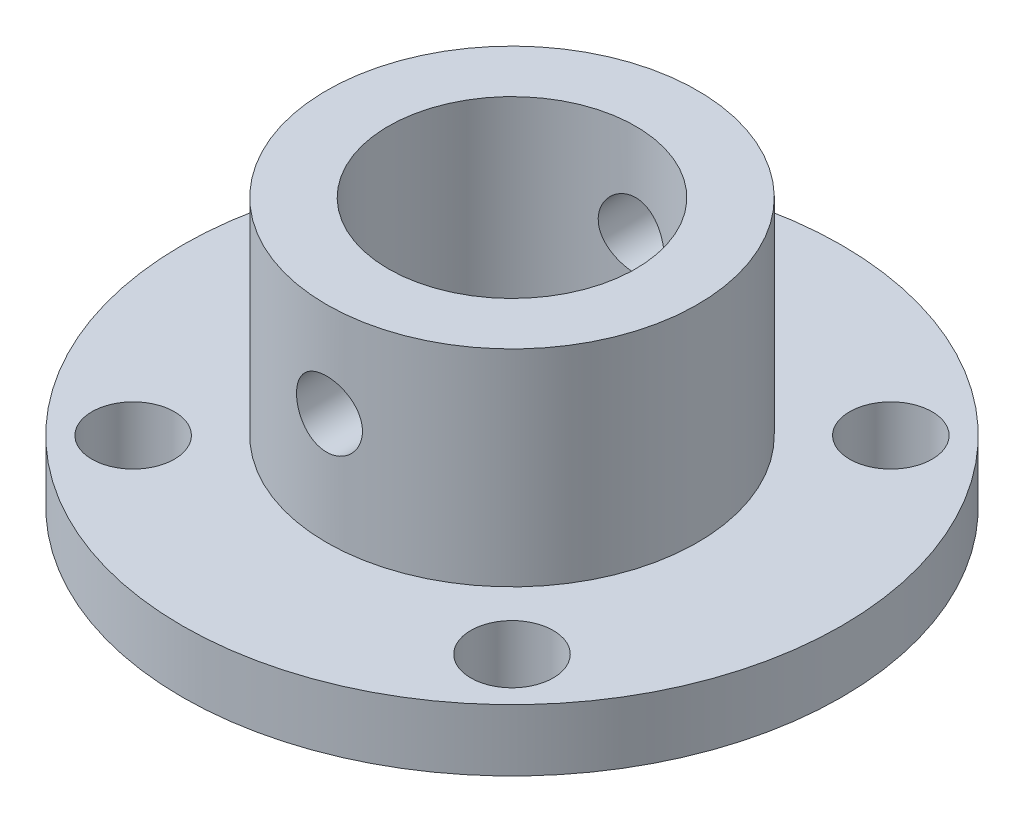
ISO-10303-21;
HEADER;
FILE_DESCRIPTION(('STEP AP214'),'2;1');
FILE_NAME('part.step','',(''),(''),'','','');
FILE_SCHEMA(('AUTOMOTIVE_DESIGN { 1 0 10303 214 1 1 1 1 }'));
ENDSEC;
DATA;
#1=APPLICATION_CONTEXT('core data for automotive mechanical design processes');
#2=APPLICATION_PROTOCOL_DEFINITION('international standard','automotive_design',2000,#1);
#3=PRODUCT_CONTEXT('',#1,'mechanical');
#4=PRODUCT('Part','Part','',(#3));
#5=PRODUCT_RELATED_PRODUCT_CATEGORY('part','',(#4));
#6=PRODUCT_DEFINITION_FORMATION('','',#4);
#7=PRODUCT_DEFINITION_CONTEXT('part definition',#1,'design');
#8=PRODUCT_DEFINITION('design','',#6,#7);
#9=PRODUCT_DEFINITION_SHAPE('','',#8);
#10=(LENGTH_UNIT() NAMED_UNIT(*) SI_UNIT(.MILLI.,.METRE.));
#11=(NAMED_UNIT(*) PLANE_ANGLE_UNIT() SI_UNIT($,.RADIAN.));
#12=(NAMED_UNIT(*) SI_UNIT($,.STERADIAN.) SOLID_ANGLE_UNIT());
#13=UNCERTAINTY_MEASURE_WITH_UNIT(LENGTH_MEASURE(1.E-05),#10,'distance_accuracy_value','');
#14=(GEOMETRIC_REPRESENTATION_CONTEXT(3) GLOBAL_UNCERTAINTY_ASSIGNED_CONTEXT((#13)) GLOBAL_UNIT_ASSIGNED_CONTEXT((#10,
#11,#12)) REPRESENTATION_CONTEXT('',''));
#15=CARTESIAN_POINT('',(0.,0.,0.));
#16=DIRECTION('',(0.,0.,1.));
#17=DIRECTION('',(1.,0.,0.));
#18=AXIS2_PLACEMENT_3D('',#15,#16,#17);
#19=CARTESIAN_POINT('',(0.,3.,0.));
#20=DIRECTION('',(0.,-1.,0.));
#21=DIRECTION('',(0.,0.,-1.));
#22=AXIS2_PLACEMENT_3D('',#19,#20,#21);
#23=CYLINDRICAL_SURFACE('',#22,16.);
#24=CARTESIAN_POINT('',(0.,3.,0.));
#25=DIRECTION('',(0.,1.,0.));
#26=DIRECTION('',(0.,0.,1.));
#27=AXIS2_PLACEMENT_3D('',#24,#25,#26);
#28=CIRCLE('',#27,16.);
#29=CARTESIAN_POINT('',(0.,3.,16.));
#30=VERTEX_POINT('',#29);
#31=EDGE_CURVE('E53',#30,#30,#28,.T.);
#32=ORIENTED_EDGE('',*,*,#31,.F.);
#33=EDGE_LOOP('',(#32));
#34=FACE_BOUND('',#33,.T.);
#35=CARTESIAN_POINT('',(0.,0.,0.));
#36=DIRECTION('',(0.,1.,0.));
#37=DIRECTION('',(0.,0.,1.));
#38=AXIS2_PLACEMENT_3D('',#35,#36,#37);
#39=CIRCLE('',#38,16.);
#40=CARTESIAN_POINT('',(0.,0.,16.));
#41=VERTEX_POINT('',#40);
#42=EDGE_CURVE('E58',#41,#41,#39,.T.);
#43=ORIENTED_EDGE('',*,*,#42,.T.);
#44=EDGE_LOOP('',(#43));
#45=FACE_BOUND('',#44,.T.);
#46=ADVANCED_FACE('F41',(#34,#45),#23,.T.);
#47=CARTESIAN_POINT('',(0.,3.,0.));
#48=DIRECTION('',(0.,1.,0.));
#49=DIRECTION('',(0.,0.,1.));
#50=AXIS2_PLACEMENT_3D('',#47,#48,#49);
#51=PLANE('',#50);
#52=CARTESIAN_POINT('',(0.,3.,0.));
#53=DIRECTION('',(0.,1.,0.));
#54=DIRECTION('',(0.,0.,1.));
#55=AXIS2_PLACEMENT_3D('',#52,#53,#54);
#56=CIRCLE('',#55,9.);
#57=CARTESIAN_POINT('',(0.,3.,9.));
#58=VERTEX_POINT('',#57);
#59=EDGE_CURVE('E10',#58,#58,#56,.T.);
#60=ORIENTED_EDGE('',*,*,#59,.F.);
#61=EDGE_LOOP('',(#60));
#62=FACE_BOUND('',#61,.T.);
#63=CARTESIAN_POINT('',(9.19238815542541,3.,9.19238815542483));
#64=DIRECTION('',(0.,1.,0.));
#65=DIRECTION('',(0.,0.,1.));
#66=AXIS2_PLACEMENT_3D('',#63,#64,#65);
#67=CIRCLE('',#66,2.00000000000041);
#68=CARTESIAN_POINT('',(9.19238815542541,3.,11.1923881554252));
#69=VERTEX_POINT('',#68);
#70=EDGE_CURVE('E81',#69,#69,#67,.T.);
#71=ORIENTED_EDGE('',*,*,#70,.F.);
#72=EDGE_LOOP('',(#71));
#73=FACE_BOUND('',#72,.T.);
#74=CARTESIAN_POINT('',(-9.19238815542514,3.,-9.1923881554251));
#75=DIRECTION('',(0.,1.,0.));
#76=DIRECTION('',(0.,0.,1.));
#77=AXIS2_PLACEMENT_3D('',#74,#75,#76);
#78=CIRCLE('',#77,2.);
#79=CARTESIAN_POINT('',(-9.19238815542514,3.,-7.1923881554251));
#80=VERTEX_POINT('',#79);
#81=EDGE_CURVE('E67',#80,#80,#78,.T.);
#82=ORIENTED_EDGE('',*,*,#81,.F.);
#83=EDGE_LOOP('',(#82));
#84=FACE_BOUND('',#83,.T.);
#85=CARTESIAN_POINT('',(9.19238815542513,3.,-9.19238815542511));
#86=DIRECTION('',(0.,1.,0.));
#87=DIRECTION('',(0.,0.,1.));
#88=AXIS2_PLACEMENT_3D('',#85,#86,#87);
#89=CIRCLE('',#88,2.);
#90=CARTESIAN_POINT('',(9.19238815542513,3.,-7.19238815542511));
#91=VERTEX_POINT('',#90);
#92=EDGE_CURVE('E68',#91,#91,#89,.T.);
#93=ORIENTED_EDGE('',*,*,#92,.F.);
#94=EDGE_LOOP('',(#93));
#95=FACE_BOUND('',#94,.T.);
#96=CARTESIAN_POINT('',(-9.19238815542483,3.,9.19238815542514));
#97=DIRECTION('',(0.,1.,0.));
#98=DIRECTION('',(0.,0.,1.));
#99=AXIS2_PLACEMENT_3D('',#96,#97,#98);
#100=CIRCLE('',#99,2.0000000000002);
#101=CARTESIAN_POINT('',(-9.19238815542483,3.,11.1923881554253));
#102=VERTEX_POINT('',#101);
#103=EDGE_CURVE('E74',#102,#102,#100,.T.);
#104=ORIENTED_EDGE('',*,*,#103,.F.);
#105=EDGE_LOOP('',(#104));
#106=FACE_BOUND('',#105,.T.);
#107=ORIENTED_EDGE('',*,*,#31,.T.);
#108=EDGE_LOOP('',(#107));
#109=FACE_BOUND('',#108,.T.);
#110=ADVANCED_FACE('F132',(#62,#73,#84,#95,#106,#109),#51,.T.);
#111=CARTESIAN_POINT('',(0.,0.,0.));
#112=DIRECTION('',(0.,1.,0.));
#113=DIRECTION('',(0.,0.,1.));
#114=AXIS2_PLACEMENT_3D('',#111,#112,#113);
#115=PLANE('',#114);
#116=CARTESIAN_POINT('',(9.19238815542541,0.,9.19238815542483));
#117=DIRECTION('',(0.,1.,0.));
#118=DIRECTION('',(0.,0.,1.));
#119=AXIS2_PLACEMENT_3D('',#116,#117,#118);
#120=CIRCLE('',#119,2.00000000000041);
#121=CARTESIAN_POINT('',(9.19238815542541,0.,11.1923881554252));
#122=VERTEX_POINT('',#121);
#123=EDGE_CURVE('E77',#122,#122,#120,.T.);
#124=ORIENTED_EDGE('',*,*,#123,.T.);
#125=EDGE_LOOP('',(#124));
#126=FACE_BOUND('',#125,.T.);
#127=CARTESIAN_POINT('',(-9.19238815542514,0.,-9.1923881554251));
#128=DIRECTION('',(0.,1.,0.));
#129=DIRECTION('',(0.,0.,1.));
#130=AXIS2_PLACEMENT_3D('',#127,#128,#129);
#131=CIRCLE('',#130,2.);
#132=CARTESIAN_POINT('',(-9.19238815542514,0.,-7.1923881554251));
#133=VERTEX_POINT('',#132);
#134=EDGE_CURVE('E84',#133,#133,#131,.T.);
#135=ORIENTED_EDGE('',*,*,#134,.T.);
#136=EDGE_LOOP('',(#135));
#137=FACE_BOUND('',#136,.T.);
#138=CARTESIAN_POINT('',(9.19238815542513,0.,-9.19238815542511));
#139=DIRECTION('',(0.,1.,0.));
#140=DIRECTION('',(0.,0.,1.));
#141=AXIS2_PLACEMENT_3D('',#138,#139,#140);
#142=CIRCLE('',#141,2.);
#143=CARTESIAN_POINT('',(9.19238815542513,0.,-7.19238815542511));
#144=VERTEX_POINT('',#143);
#145=EDGE_CURVE('E64',#144,#144,#142,.T.);
#146=ORIENTED_EDGE('',*,*,#145,.T.);
#147=EDGE_LOOP('',(#146));
#148=FACE_BOUND('',#147,.T.);
#149=CARTESIAN_POINT('',(-9.19238815542483,0.,9.19238815542514));
#150=DIRECTION('',(0.,1.,0.));
#151=DIRECTION('',(0.,0.,1.));
#152=AXIS2_PLACEMENT_3D('',#149,#150,#151);
#153=CIRCLE('',#152,2.0000000000002);
#154=CARTESIAN_POINT('',(-9.19238815542483,0.,11.1923881554253));
#155=VERTEX_POINT('',#154);
#156=EDGE_CURVE('E71',#155,#155,#153,.T.);
#157=ORIENTED_EDGE('',*,*,#156,.T.);
#158=EDGE_LOOP('',(#157));
#159=FACE_BOUND('',#158,.T.);
#160=CARTESIAN_POINT('',(0.,0.,0.));
#161=DIRECTION('',(0.,1.,0.));
#162=DIRECTION('',(0.,0.,1.));
#163=AXIS2_PLACEMENT_3D('',#160,#161,#162);
#164=CIRCLE('',#163,6.);
#165=CARTESIAN_POINT('',(0.,0.,6.));
#166=VERTEX_POINT('',#165);
#167=EDGE_CURVE('E80',#166,#166,#164,.T.);
#168=ORIENTED_EDGE('',*,*,#167,.T.);
#169=EDGE_LOOP('',(#168));
#170=FACE_BOUND('',#169,.T.);
#171=ORIENTED_EDGE('',*,*,#42,.F.);
#172=EDGE_LOOP('',(#171));
#173=FACE_BOUND('',#172,.T.);
#174=ADVANCED_FACE('F128',(#126,#137,#148,#159,#170,#173),#115,.F.);
#175=CARTESIAN_POINT('',(0.,0.,0.));
#176=DIRECTION('',(0.,1.,0.));
#177=DIRECTION('',(0.,0.,1.));
#178=AXIS2_PLACEMENT_3D('',#175,#176,#177);
#179=CYLINDRICAL_SURFACE('',#178,6.);
#180=CARTESIAN_POINT('',(0.,6.8,6.));
#181=CARTESIAN_POINT('',(0.0882036446662835,6.80000209354788,5.9999986704813));
#182=CARTESIAN_POINT('',(0.176429728177473,6.80731809135174,5.99803588929723));
#183=CARTESIAN_POINT('',(0.350340361083571,6.83633698459095,5.99039658897325));
#184=CARTESIAN_POINT('',(0.436023666655269,6.85804680354089,5.98471828266059));
#185=CARTESIAN_POINT('',(0.602313271236251,6.91509733349123,5.97027466602242));
#186=CARTESIAN_POINT('',(0.682925960812229,6.95042047013283,5.96151333704337));
#187=CARTESIAN_POINT('',(0.837082949114126,7.03362979413328,5.94182959321305));
#188=CARTESIAN_POINT('',(0.910626776359695,7.08151681868739,5.93090703436005));
#189=CARTESIAN_POINT('',(1.05026360299202,7.18966681313074,5.90779691921738));
#190=CARTESIAN_POINT('',(1.11616935189025,7.25016693440678,5.8955877414348));
#191=CARTESIAN_POINT('',(1.23702970928508,7.38131878645052,5.87141927743138));
#192=CARTESIAN_POINT('',(1.29198290796523,7.45197182209339,5.85946002355797));
#193=CARTESIAN_POINT('',(1.39029127394741,7.602918587861,5.83692429973529));
#194=CARTESIAN_POINT('',(1.43343102189222,7.68335706261179,5.82637510858234));
#195=CARTESIAN_POINT('',(1.50550038461563,7.85067208887154,5.80817181846909));
#196=CARTESIAN_POINT('',(1.53443261960976,7.93754744985618,5.8005171857408));
#197=CARTESIAN_POINT('',(1.5766153618114,8.11319643026132,5.78919292669855));
#198=CARTESIAN_POINT('',(1.59020536195949,8.20188283196173,5.78543718352245));
#199=CARTESIAN_POINT('',(1.60237627764874,8.38035014666634,5.78207864835752));
#200=CARTESIAN_POINT('',(1.60095999764589,8.4701308520285,5.78247508038722));
#201=CARTESIAN_POINT('',(1.58342808002097,8.6455883322979,5.78729903015237));
#202=CARTESIAN_POINT('',(1.56772324851795,8.73130974563043,5.79161388402151));
#203=CARTESIAN_POINT('',(1.52271798977763,8.89885466756536,5.80360810471625));
#204=CARTESIAN_POINT('',(1.493416475944,8.98067786406038,5.81128774043995));
#205=CARTESIAN_POINT('',(1.421714855722,9.13917451504676,5.82924529396782));
#206=CARTESIAN_POINT('',(1.37917072910226,9.21577947142898,5.83955154254445));
#207=CARTESIAN_POINT('',(1.28229203059023,9.36090732708125,5.86158583714473));
#208=CARTESIAN_POINT('',(1.22795513779402,9.42942863132519,5.8733141628429));
#209=CARTESIAN_POINT('',(1.10693285810735,9.55879119796383,5.89734008503746));
#210=CARTESIAN_POINT('',(1.03990250182639,9.61930905465196,5.90964377191026));
#211=CARTESIAN_POINT('',(0.896494134565099,9.72831102428023,5.93309105021092));
#212=CARTESIAN_POINT('',(0.820115755364073,9.77679466296194,5.94423459590854));
#213=CARTESIAN_POINT('',(0.659678604397962,9.86049432225972,5.96417456318624));
#214=CARTESIAN_POINT('',(0.575587922041432,9.89565181635888,5.97296058266845));
#215=CARTESIAN_POINT('',(0.402401835512317,9.9512377510507,5.98712035520802));
#216=CARTESIAN_POINT('',(0.313307529542659,9.97166941017917,5.99249485386999));
#217=CARTESIAN_POINT('',(0.135403266516412,9.99671590153426,5.99911326846707));
#218=CARTESIAN_POINT('',(0.0466593901131044,10.0017704318807,6.00047197976769));
#219=CARTESIAN_POINT('',(-0.130408036720958,9.99713346860245,5.99923577353354));
#220=CARTESIAN_POINT('',(-0.218731629649689,9.98744349911539,5.99664126464274));
#221=CARTESIAN_POINT('',(-0.390881959921425,9.95395324203202,5.98786428396825));
#222=CARTESIAN_POINT('',(-0.474759881622232,9.93039820304177,5.98174421237093));
#223=CARTESIAN_POINT('',(-0.637365576940845,9.87013124439366,5.96661035915282));
#224=CARTESIAN_POINT('',(-0.716092791372797,9.83341789899964,5.9575962639682));
#225=CARTESIAN_POINT('',(-0.867870779734385,9.7470608902555,5.93740528447735));
#226=CARTESIAN_POINT('',(-0.94078015076904,9.69717802656153,5.92618949284386));
#227=CARTESIAN_POINT('',(-1.07734770831762,9.58619869587388,5.9028916189203));
#228=CARTESIAN_POINT('',(-1.14100406303899,9.52510001392018,5.89080936580444));
#229=CARTESIAN_POINT('',(-1.25911139583055,9.39137153800331,5.86671796694981));
#230=CARTESIAN_POINT('',(-1.31325215399989,9.31846515087989,5.85472049149563));
#231=CARTESIAN_POINT('',(-1.40853752947959,9.16434824312428,5.83253157740069));
#232=CARTESIAN_POINT('',(-1.44968268897221,9.08313806911702,5.82234006342218));
#233=CARTESIAN_POINT('',(-1.51749929269189,8.91512375432943,5.80503414721321));
#234=CARTESIAN_POINT('',(-1.54425449804718,8.8283553505015,5.79790198738987));
#235=CARTESIAN_POINT('',(-1.58272964096634,8.65132854421294,5.78751860185751));
#236=CARTESIAN_POINT('',(-1.5944534208239,8.56107103970634,5.78426638438256));
#237=CARTESIAN_POINT('',(-1.60231191722602,8.38280416970196,5.78209395637349));
#238=CARTESIAN_POINT('',(-1.59894524494388,8.29481814379578,5.78303518188826));
#239=CARTESIAN_POINT('',(-1.5778750080045,8.12071718878957,5.78881916870635));
#240=CARTESIAN_POINT('',(-1.56017181228047,8.0346022115989,5.79366182961091));
#241=CARTESIAN_POINT('',(-1.51122012559733,7.86731539829676,5.80662056856999));
#242=CARTESIAN_POINT('',(-1.48007728860457,7.78611052581443,5.81471108015306));
#243=CARTESIAN_POINT('',(-1.40521243649916,7.63001693557252,5.83325454509352));
#244=CARTESIAN_POINT('',(-1.36148844819695,7.55512921095956,5.84370786897202));
#245=CARTESIAN_POINT('',(-1.26119127415051,7.41141571240276,5.86618337152254));
#246=CARTESIAN_POINT('',(-1.20427783814327,7.34283317201904,5.87824266481322));
#247=CARTESIAN_POINT('',(-1.07986442808881,7.21603003866613,5.90236403026437));
#248=CARTESIAN_POINT('',(-1.012361883487,7.15781196906492,5.91442610238761));
#249=CARTESIAN_POINT('',(-0.866943984870946,7.05216620988252,5.93750249923166));
#250=CARTESIAN_POINT('',(-0.788836769401423,7.00499599148054,5.94848889051638));
#251=CARTESIAN_POINT('',(-0.625510912333512,6.92453006725651,5.9678704808232));
#252=CARTESIAN_POINT('',(-0.540296875757038,6.89122545946912,5.97626734146876));
#253=CARTESIAN_POINT('',(-0.379499763904793,6.84377977166759,5.98843802010774));
#254=CARTESIAN_POINT('',(-0.304609613252029,6.827400493126,5.99274216474082));
#255=CARTESIAN_POINT('',(-0.153151836253661,6.80551023506635,5.99852359229165));
#256=CARTESIAN_POINT('',(-0.0765843763238883,6.79999818223998,6.00000115437816));
#257=CARTESIAN_POINT('',(0.,6.8,6.));
#258=B_SPLINE_CURVE_WITH_KNOTS('',3,(#180,#181,#182,#183,#184,#185,#186,#187,#188,#189,#190,
#191,#192,#193,#194,#195,#196,#197,#198,#199,#200,#201,#202,#203,#204,#205,#206,#207,#208,#209,
#210,#211,#212,#213,#214,#215,#216,#217,#218,#219,#220,#221,#222,#223,#224,#225,#226,#227,#228,
#229,#230,#231,#232,#233,#234,#235,#236,#237,#238,#239,#240,#241,#242,#243,#244,#245,#246,#247,
#248,#249,#250,#251,#252,#253,#254,#255,#256,#257),.UNSPECIFIED.,.T.,.F.,(4,2,2,2,2,2,2,2,2,2,2,
2,2,2,2,2,2,2,2,2,2,2,2,2,2,2,2,2,2,2,2,2,2,2,2,2,2,2,4),(0.,0.264330079159655,0.52878739500916,
0.792904442377546,1.0570390936694,1.32667918363974,1.59635395940119,1.87066066018583,
2.1449167530376,2.41297726598071,2.68098768318788,2.94152801632129,3.20208917445683,
3.4655893867253,3.72914150489436,4.00129007845189,4.2734493754541,4.54679047677765,
4.82007181747443,5.08546174014969,5.35082423135612,5.61162828509024,5.87246060615823,
6.13840228798972,6.40439654602441,6.67789197101562,6.95137598414618,7.2232503815319,
7.49505526923061,7.75794673914764,8.0208314440835,8.28168612350517,8.54258173690278,
8.81115471648986,9.07979299457834,9.35417801816593,9.62838660908019,9.85791855186544,
10.0874278236498),.UNSPECIFIED.);
#259=CARTESIAN_POINT('',(0.,6.8,6.));
#260=VERTEX_POINT('',#259);
#261=EDGE_CURVE('E118',#260,#260,#258,.T.);
#262=ORIENTED_EDGE('',*,*,#261,.T.);
#263=EDGE_LOOP('',(#262));
#264=FACE_BOUND('',#263,.T.);
#265=CARTESIAN_POINT('',(1.6,8.4,-5.78273291792039));
#266=CARTESIAN_POINT('',(1.59999787452613,8.311859249809,-5.7827344455633));
#267=CARTESIAN_POINT('',(1.59269194579772,8.22369599961952,-5.78477011639344));
#268=CARTESIAN_POINT('',(1.56371666608212,8.04991566275458,-5.79266848924472));
#269=CARTESIAN_POINT('',(1.54204010896768,7.96429987601747,-5.79853311126453));
#270=CARTESIAN_POINT('',(1.48508676448053,7.79815354404267,-5.81337900141365));
#271=CARTESIAN_POINT('',(1.44982910033741,7.71761603293728,-5.82235588547335));
#272=CARTESIAN_POINT('',(1.36677427650965,7.56358660795212,-5.8424092393635));
#273=CARTESIAN_POINT('',(1.3189761427316,7.49009524199441,-5.85348587227547));
#274=CARTESIAN_POINT('',(1.21091878299647,7.35040596240983,-5.87680111642766));
#275=CARTESIAN_POINT('',(1.15040238003367,7.28441038602843,-5.88906032893152));
#276=CARTESIAN_POINT('',(1.01917941827217,7.16337473843904,-5.91318161149208));
#277=CARTESIAN_POINT('',(0.948471804277317,7.10833580308657,-5.92504364026752));
#278=CARTESIAN_POINT('',(0.797470536698617,7.00993204927766,-5.94726390774734));
#279=CARTESIAN_POINT('',(0.717041455903585,6.96676838509372,-5.95759501009834));
#280=CARTESIAN_POINT('',(0.549746435783274,6.89465229170619,-5.97535300969467));
#281=CARTESIAN_POINT('',(0.462881584700084,6.86569746617476,-5.9827803966101));
#282=CARTESIAN_POINT('',(0.287292769448073,6.82347582381139,-5.99374842861169));
#283=CARTESIAN_POINT('',(0.198656979360734,6.80986481869927,-5.99737421400212));
#284=CARTESIAN_POINT('',(0.0202908428068609,6.79763430391426,-6.000628196942));
#285=CARTESIAN_POINT('',(-0.0694393179508235,6.79901228509589,-6.00025706357286));
#286=CARTESIAN_POINT('',(-0.245051389689077,6.81647825003158,-5.99562140687813));
#287=CARTESIAN_POINT('',(-0.330973280576888,6.83219436610903,-5.99145531221602));
#288=CARTESIAN_POINT('',(-0.498913052456844,6.87728971022556,-5.97981398872374));
#289=CARTESIAN_POINT('',(-0.580930710544464,6.90666971734884,-5.97233857120463));
#290=CARTESIAN_POINT('',(-0.739683156118043,6.9785438780739,-5.95477255279922));
#291=CARTESIAN_POINT('',(-0.816357349063633,7.02116544568056,-5.94465670302171));
#292=CARTESIAN_POINT('',(-0.961591999011613,7.11821505560728,-5.9228997480757));
#293=CARTESIAN_POINT('',(-1.03015087046869,7.17264539922254,-5.91125834578275));
#294=CARTESIAN_POINT('',(-1.15942829557249,7.29374148634714,-5.88729018351104));
#295=CARTESIAN_POINT('',(-1.21984153614219,7.36073155603952,-5.87495335495478));
#296=CARTESIAN_POINT('',(-1.32865065683815,7.50401974099102,-5.85130724018329));
#297=CARTESIAN_POINT('',(-1.37704580423844,7.58031842336025,-5.83999801664631));
#298=CARTESIAN_POINT('',(-1.46067743349021,7.74072008145716,-5.81964721826454));
#299=CARTESIAN_POINT('',(-1.49583093280429,7.82486828073094,-5.81062005680583));
#300=CARTESIAN_POINT('',(-1.55139201348531,7.99818119956356,-5.79603460063156));
#301=CARTESIAN_POINT('',(-1.57180325169042,8.08734466915874,-5.79047544571885));
#302=CARTESIAN_POINT('',(-1.59677405674218,8.26530176881729,-5.78363868515234));
#303=CARTESIAN_POINT('',(-1.60178906096974,8.35402683888858,-5.78223810662157));
#304=CARTESIAN_POINT('',(-1.597079848984,8.53104781824198,-5.78354062803713));
#305=CARTESIAN_POINT('',(-1.58735720137773,8.61934377219377,-5.78624329125356));
#306=CARTESIAN_POINT('',(-1.55385017495931,8.79124527527808,-5.79532899431386));
#307=CARTESIAN_POINT('',(-1.53033958330325,8.87490835035109,-5.80164031753083));
#308=CARTESIAN_POINT('',(-1.47023189380392,9.03710370508665,-5.81716215168585));
#309=CARTESIAN_POINT('',(-1.43363308701324,9.11563531314159,-5.82637304120572));
#310=CARTESIAN_POINT('',(-1.34746324406962,9.26724396594853,-5.84690857976629));
#311=CARTESIAN_POINT('',(-1.29762476190338,9.34016318071189,-5.8582752389782));
#312=CARTESIAN_POINT('',(-1.18672182390013,9.47677064136243,-5.88174273547405));
#313=CARTESIAN_POINT('',(-1.12565525778373,9.54045714796329,-5.89384371048319));
#314=CARTESIAN_POINT('',(-0.99192302600387,9.65868197859996,-5.91783971907433));
#315=CARTESIAN_POINT('',(-0.918973132807076,9.71290270158287,-5.92971869219044));
#316=CARTESIAN_POINT('',(-0.764742748752594,9.80832878992841,-5.95157336013737));
#317=CARTESIAN_POINT('',(-0.683462701615107,9.84953484806313,-5.96154915626333));
#318=CARTESIAN_POINT('',(-0.515451307860697,9.91738370588921,-5.978409207194));
#319=CARTESIAN_POINT('',(-0.428766282305868,9.94413521555478,-5.98531646784308));
#320=CARTESIAN_POINT('',(-0.251919507785057,9.98263098245149,-5.99536243029798));
#321=CARTESIAN_POINT('',(-0.161758533856199,9.99437856541975,-5.99850196723977));
#322=CARTESIAN_POINT('',(0.0165136010769246,10.0023246589931,-6.0006193075016));
#323=CARTESIAN_POINT('',(0.10460280922231,9.99898905530491,-5.99972181030494));
#324=CARTESIAN_POINT('',(0.278918643704556,9.97794520513986,-5.9941479278306));
#325=CARTESIAN_POINT('',(0.365145339850184,9.96023749830647,-5.98947168443723));
#326=CARTESIAN_POINT('',(0.532728098771436,9.91121551606502,-5.97689048312844));
#327=CARTESIAN_POINT('',(0.614113609481483,9.87999576522168,-5.96900797751776));
#328=CARTESIAN_POINT('',(0.770537678776833,9.80492031860339,-5.95083853212803));
#329=CARTESIAN_POINT('',(0.845575345328786,9.76106285071116,-5.9405512551794));
#330=CARTESIAN_POINT('',(0.989342614939897,9.66059338228894,-5.91833064980799));
#331=CARTESIAN_POINT('',(1.05785068939028,9.60367249543562,-5.90636074702982));
#332=CARTESIAN_POINT('',(1.18450029724544,9.47927780051353,-5.88227200056129));
#333=CARTESIAN_POINT('',(1.24263909793084,9.41180121936489,-5.87015311850574));
#334=CARTESIAN_POINT('',(1.34816560187261,9.26642528332749,-5.84683167732792));
#335=CARTESIAN_POINT('',(1.39528875413901,9.1883293490008,-5.83565513061492));
#336=CARTESIAN_POINT('',(1.47566951228968,9.0250349512375,-5.81585115203583));
#337=CARTESIAN_POINT('',(1.50893618695116,8.93984117714822,-5.80722205399804));
#338=CARTESIAN_POINT('',(1.55630499401031,8.77913493117279,-5.79468800506476));
#339=CARTESIAN_POINT('',(1.57265214719335,8.70431898835834,-5.79024112213281));
#340=CARTESIAN_POINT('',(1.59449995435361,8.55300755360111,-5.78426308173731));
#341=CARTESIAN_POINT('',(1.60000184505801,8.47651225416789,-5.7827315918209));
#342=CARTESIAN_POINT('',(1.6,8.4,-5.78273291792039));
#343=B_SPLINE_CURVE_WITH_KNOTS('',3,(#265,#266,#267,#268,#269,#270,#271,#272,#273,#274,#275,
#276,#277,#278,#279,#280,#281,#282,#283,#284,#285,#286,#287,#288,#289,#290,#291,#292,#293,#294,
#295,#296,#297,#298,#299,#300,#301,#302,#303,#304,#305,#306,#307,#308,#309,#310,#311,#312,#313,
#314,#315,#316,#317,#318,#319,#320,#321,#322,#323,#324,#325,#326,#327,#328,#329,#330,#331,#332,
#333,#334,#335,#336,#337,#338,#339,#340,#341,#342),.UNSPECIFIED.,.T.,.F.,(4,2,2,2,2,2,2,2,2,2,2,
2,2,2,2,2,2,2,2,2,2,2,2,2,2,2,2,2,2,2,2,2,2,2,2,2,2,2,4),(0.,0.26414090249282,0.528414358280161,
0.792317049276935,1.05624024524884,1.32612732904169,1.59604237699569,1.87028165896643,
2.14447467443397,2.41238643453184,2.68025334708482,2.94136456640643,3.20249067552557,
3.46621159124456,3.72998394715593,4.00185409840264,4.27374082111663,4.54730412077229,
4.82079953934806,5.08612267391536,5.35141757070659,5.61161480341915,5.87184602287715,
6.13779707970074,6.40379817229035,6.67748725563562,6.95116176802339,7.22274831668977,
7.4942746556306,7.75747243929027,8.02066034086226,8.28203611890788,8.54344856608627,
8.81183083189117,9.08028372300694,9.35464031183428,9.62881705674851,9.8581357413103,
10.0874282742632),.UNSPECIFIED.);
#344=CARTESIAN_POINT('',(1.6,8.4,-5.78273291792039));
#345=VERTEX_POINT('',#344);
#346=EDGE_CURVE('E112',#345,#345,#343,.T.);
#347=ORIENTED_EDGE('',*,*,#346,.T.);
#348=EDGE_LOOP('',(#347));
#349=FACE_BOUND('',#348,.T.);
#350=ORIENTED_EDGE('',*,*,#167,.F.);
#351=EDGE_LOOP('',(#350));
#352=FACE_BOUND('',#351,.T.);
#353=CARTESIAN_POINT('',(0.,13.,0.));
#354=DIRECTION('',(0.,1.,0.));
#355=DIRECTION('',(0.,0.,1.));
#356=AXIS2_PLACEMENT_3D('',#353,#354,#355);
#357=CIRCLE('',#356,6.);
#358=CARTESIAN_POINT('',(0.,13.,6.));
#359=VERTEX_POINT('',#358);
#360=EDGE_CURVE('E213',#359,#359,#357,.F.);
#361=ORIENTED_EDGE('',*,*,#360,.F.);
#362=EDGE_LOOP('',(#361));
#363=FACE_BOUND('',#362,.T.);
#364=ADVANCED_FACE('F122',(#264,#349,#352,#363),#179,.F.);
#365=CARTESIAN_POINT('',(-9.19238815542483,0.,9.19238815542514));
#366=DIRECTION('',(0.,1.,0.));
#367=DIRECTION('',(0.,0.,1.));
#368=AXIS2_PLACEMENT_3D('',#365,#366,#367);
#369=CYLINDRICAL_SURFACE('',#368,2.0000000000002);
#370=ORIENTED_EDGE('',*,*,#156,.F.);
#371=EDGE_LOOP('',(#370));
#372=FACE_BOUND('',#371,.T.);
#373=ORIENTED_EDGE('',*,*,#103,.T.);
#374=EDGE_LOOP('',(#373));
#375=FACE_BOUND('',#374,.T.);
#376=ADVANCED_FACE('F127',(#372,#375),#369,.F.);
#377=CARTESIAN_POINT('',(9.19238815542513,0.,-9.19238815542511));
#378=DIRECTION('',(0.,1.,0.));
#379=DIRECTION('',(0.,0.,1.));
#380=AXIS2_PLACEMENT_3D('',#377,#378,#379);
#381=CYLINDRICAL_SURFACE('',#380,2.);
#382=ORIENTED_EDGE('',*,*,#145,.F.);
#383=EDGE_LOOP('',(#382));
#384=FACE_BOUND('',#383,.T.);
#385=ORIENTED_EDGE('',*,*,#92,.T.);
#386=EDGE_LOOP('',(#385));
#387=FACE_BOUND('',#386,.T.);
#388=ADVANCED_FACE('F229',(#384,#387),#381,.F.);
#389=CARTESIAN_POINT('',(-9.19238815542514,0.,-9.1923881554251));
#390=DIRECTION('',(0.,1.,0.));
#391=DIRECTION('',(0.,0.,1.));
#392=AXIS2_PLACEMENT_3D('',#389,#390,#391);
#393=CYLINDRICAL_SURFACE('',#392,2.);
#394=ORIENTED_EDGE('',*,*,#134,.F.);
#395=EDGE_LOOP('',(#394));
#396=FACE_BOUND('',#395,.T.);
#397=ORIENTED_EDGE('',*,*,#81,.T.);
#398=EDGE_LOOP('',(#397));
#399=FACE_BOUND('',#398,.T.);
#400=ADVANCED_FACE('F130',(#396,#399),#393,.F.);
#401=CARTESIAN_POINT('',(9.19238815542541,0.,9.19238815542483));
#402=DIRECTION('',(0.,1.,0.));
#403=DIRECTION('',(0.,0.,1.));
#404=AXIS2_PLACEMENT_3D('',#401,#402,#403);
#405=CYLINDRICAL_SURFACE('',#404,2.00000000000041);
#406=ORIENTED_EDGE('',*,*,#123,.F.);
#407=EDGE_LOOP('',(#406));
#408=FACE_BOUND('',#407,.T.);
#409=ORIENTED_EDGE('',*,*,#70,.T.);
#410=EDGE_LOOP('',(#409));
#411=FACE_BOUND('',#410,.T.);
#412=ADVANCED_FACE('F161',(#408,#411),#405,.F.);
#413=CARTESIAN_POINT('',(0.,13.,0.));
#414=DIRECTION('',(0.,-1.,0.));
#415=DIRECTION('',(0.,0.,-1.));
#416=AXIS2_PLACEMENT_3D('',#413,#414,#415);
#417=CYLINDRICAL_SURFACE('',#416,9.);
#418=CARTESIAN_POINT('',(0.,10.,-9.));
#419=CARTESIAN_POINT('',(-0.0891199889022124,9.99999650999753,-8.99999842101241));
#420=CARTESIAN_POINT('',(-0.178286373811932,9.99252886703613,-8.99866254538545));
#421=CARTESIAN_POINT('',(-0.354112162977067,9.96287155401015,-8.99346217162353));
#422=CARTESIAN_POINT('',(-0.440769290112072,9.94066892370501,-8.98959544750788));
#423=CARTESIAN_POINT('',(-0.609007816682141,9.88223829206875,-8.97976647847911));
#424=CARTESIAN_POINT('',(-0.690593523221338,9.84602238630523,-8.97380604116375));
#425=CARTESIAN_POINT('',(-0.846521639833109,9.76062632259557,-8.9604426739079));
#426=CARTESIAN_POINT('',(-0.920864750907525,9.71144742103254,-8.95303988377943));
#427=CARTESIAN_POINT('',(-1.06101042913895,9.60095610959205,-8.93752107386243));
#428=CARTESIAN_POINT('',(-1.12672329975455,9.53953079061428,-8.92939884036114));
#429=CARTESIAN_POINT('',(-1.24696773358254,9.40653325277929,-8.91340337467269));
#430=CARTESIAN_POINT('',(-1.30149854179097,9.33496034931671,-8.90553015932936));
#431=CARTESIAN_POINT('',(-1.39819750156619,9.18307389304275,-8.89086390002565));
#432=CARTESIAN_POINT('',(-1.44027562556876,9.10270218151321,-8.88407887715324));
#433=CARTESIAN_POINT('',(-1.51029875147196,8.93589010241383,-8.87244417371761));
#434=CARTESIAN_POINT('',(-1.53824484413461,8.84945020379562,-8.86759434379518));
#435=CARTESIAN_POINT('',(-1.57892525274373,8.67391103529109,-8.86044137771626));
#436=CARTESIAN_POINT('',(-1.59181525903408,8.58484892785443,-8.85811219515826));
#437=CARTESIAN_POINT('',(-1.60250059457246,8.4057979383732,-8.85618559649113));
#438=CARTESIAN_POINT('',(-1.60029713955403,8.31580913155451,-8.85658796036402));
#439=CARTESIAN_POINT('',(-1.5809846181553,8.13857914392947,-8.86005524545088));
#440=CARTESIAN_POINT('',(-1.56405155315557,8.05131807918593,-8.86308872669843));
#441=CARTESIAN_POINT('',(-1.51603718898619,7.88089546055713,-8.87142714923806));
#442=CARTESIAN_POINT('',(-1.48495534402251,7.79773406495518,-8.87673217815541));
#443=CARTESIAN_POINT('',(-1.40935057289568,7.63735073761909,-8.88904934759434));
#444=CARTESIAN_POINT('',(-1.3647556123636,7.5601634912911,-8.89607059700136));
#445=CARTESIAN_POINT('',(-1.26344153576323,7.41430103908486,-8.91102292647752));
#446=CARTESIAN_POINT('',(-1.2067213099282,7.34562661325334,-8.91895408979587));
#447=CARTESIAN_POINT('',(-1.08181303730033,7.21772140413576,-8.93497015847767));
#448=CARTESIAN_POINT('',(-1.01347422269308,7.15863783095746,-8.94305565233282));
#449=CARTESIAN_POINT('',(-0.867775747328103,7.05275278362007,-8.95836603849457));
#450=CARTESIAN_POINT('',(-0.790416012610208,7.00595141016978,-8.96559092374428));
#451=CARTESIAN_POINT('',(-0.628725387252161,6.92594160196901,-8.97837847205809));
#452=CARTESIAN_POINT('',(-0.544387323694017,6.8927473677391,-8.9839393969741));
#453=CARTESIAN_POINT('',(-0.371211899336644,6.84103703919972,-8.99275880001199));
#454=CARTESIAN_POINT('',(-0.282374968380259,6.82251954541019,-8.9960174976563));
#455=CARTESIAN_POINT('',(-0.103991168574757,6.80089067226623,-8.99983543164877));
#456=CARTESIAN_POINT('',(-0.0144695096828561,6.79757740804007,-9.00043003979579));
#457=CARTESIAN_POINT('',(0.163849121698736,6.80591109791396,-8.99895010874175));
#458=CARTESIAN_POINT('',(0.252646125889519,6.81755739401701,-8.9968756869381));
#459=CARTESIAN_POINT('',(0.426362531500534,6.85531171482474,-8.99031274069892));
#460=CARTESIAN_POINT('',(0.511304597461476,6.88131864407655,-8.98584109846802));
#461=CARTESIAN_POINT('',(0.675623007789177,6.94694737387567,-8.97498301575709));
#462=CARTESIAN_POINT('',(0.754999004457336,6.9865700240528,-8.96859645578811));
#463=CARTESIAN_POINT('',(0.90680107105383,7.07875974307018,-8.95452886378439));
#464=CARTESIAN_POINT('',(0.979150264548991,7.13145149546752,-8.94683560234911));
#465=CARTESIAN_POINT('',(1.11405184565034,7.24811364152417,-8.93104192631921));
#466=CARTESIAN_POINT('',(1.17660341600601,7.3120849751037,-8.9229414778342));
#467=CARTESIAN_POINT('',(1.29089228646818,7.45040034951394,-8.9071304689102));
#468=CARTESIAN_POINT('',(1.34249245590756,7.52485846643002,-8.89942567549632));
#469=CARTESIAN_POINT('',(1.4324527450687,7.68150445705407,-8.88539029596841));
#470=CARTESIAN_POINT('',(1.47081332418193,7.76369206243588,-8.87905966217619));
#471=CARTESIAN_POINT('',(1.53300592917691,7.93309895021014,-8.8685336915973));
#472=CARTESIAN_POINT('',(1.55690340007955,8.0202935822484,-8.86432875059592));
#473=CARTESIAN_POINT('',(1.5896953542958,8.19754125276742,-8.85850726118019));
#474=CARTESIAN_POINT('',(1.59859134138627,8.28759400382285,-8.85689045332734));
#475=CARTESIAN_POINT('',(1.60108148470831,8.4666301769728,-8.85644051064373));
#476=CARTESIAN_POINT('',(1.59489171371261,8.55561056775652,-8.85756806805314));
#477=CARTESIAN_POINT('',(1.56785629660067,8.73124158974503,-8.86239313508238));
#478=CARTESIAN_POINT('',(1.54701071784785,8.8178922316563,-8.86609063288983));
#479=CARTESIAN_POINT('',(1.4913426083545,8.98630350608332,-8.87562318192817));
#480=CARTESIAN_POINT('',(1.45654117989918,9.06807130831137,-8.88145500474261));
#481=CARTESIAN_POINT('',(1.37397214829578,9.22464242816941,-8.89460176575639));
#482=CARTESIAN_POINT('',(1.32620375866526,9.29944532298858,-8.90191679390947));
#483=CARTESIAN_POINT('',(1.21829594749924,9.44105014594484,-8.91732902502244));
#484=CARTESIAN_POINT('',(1.1579984307139,9.5077306161562,-8.92543544320789));
#485=CARTESIAN_POINT('',(1.02707564037896,9.63009985331686,-8.94144596625312));
#486=CARTESIAN_POINT('',(0.956447994090281,9.68578608806405,-8.94935002414111));
#487=CARTESIAN_POINT('',(0.806197276783407,9.78499697811787,-8.96413880199544));
#488=CARTESIAN_POINT('',(0.726506966982223,9.82842111602936,-8.97101489116936));
#489=CARTESIAN_POINT('',(0.560868965742403,9.90119715800776,-8.98288895349221));
#490=CARTESIAN_POINT('',(0.474927416325986,9.93056266557114,-8.98788874118243));
#491=CARTESIAN_POINT('',(0.323910705887375,9.9682264303516,-8.99439282129417));
#492=CARTESIAN_POINT('',(0.259733829734237,9.98012177954452,-8.99648394692916));
#493=CARTESIAN_POINT('',(0.130379566355957,9.99600975712086,-8.9992880992576));
#494=CARTESIAN_POINT('',(0.065202200412155,10.0000025533648,-9.00000115522305));
#495=CARTESIAN_POINT('',(0.,10.,-9.));
#496=B_SPLINE_CURVE_WITH_KNOTS('',3,(#418,#419,#420,#421,#422,#423,#424,#425,#426,#427,#428,
#429,#430,#431,#432,#433,#434,#435,#436,#437,#438,#439,#440,#441,#442,#443,#444,#445,#446,#447,
#448,#449,#450,#451,#452,#453,#454,#455,#456,#457,#458,#459,#460,#461,#462,#463,#464,#465,#466,
#467,#468,#469,#470,#471,#472,#473,#474,#475,#476,#477,#478,#479,#480,#481,#482,#483,#484,#485,
#486,#487,#488,#489,#490,#491,#492,#493,#494,#495),.UNSPECIFIED.,.T.,.F.,(4,2,2,2,2,2,2,2,2,2,2,
2,2,2,2,2,2,2,2,2,2,2,2,2,2,2,2,2,2,2,2,2,2,2,2,2,2,2,4),(0.,0.26712157461523,0.534478409438381,
0.801604987979056,1.06870568592856,1.33839346950073,1.60809945618666,1.87971016674491,
2.15129991019101,2.42005564284313,2.68878972827276,2.95435619462343,3.21993290615981,
3.48695100494024,3.75399355306364,4.02481082247453,4.29563031240195,4.5667317165881,
4.8378072671677,5.10527280313427,5.37272657501887,5.63832110619031,5.90393221364347,
6.17218198568697,6.44045412138395,6.71190959939084,6.98335565740307,7.25356406549826,
7.52374538578562,7.7900797081413,8.05641280633542,8.32234469843295,8.58829272364878,
8.85782605825658,9.1274213997866,9.39916649807141,9.67064811458914,9.86608445414368,
10.0615166423319),.UNSPECIFIED.);
#497=CARTESIAN_POINT('',(0.,10.,-9.));
#498=VERTEX_POINT('',#497);
#499=EDGE_CURVE('E44',#498,#498,#496,.T.);
#500=ORIENTED_EDGE('',*,*,#499,.T.);
#501=EDGE_LOOP('',(#500));
#502=FACE_BOUND('',#501,.T.);
#503=CARTESIAN_POINT('',(1.6,8.4,8.85663593019381));
#504=CARTESIAN_POINT('',(1.59999649977151,8.31089255573854,8.85663760578755));
#505=CARTESIAN_POINT('',(1.59253088795427,8.22173868590416,8.8579952971073));
#506=CARTESIAN_POINT('',(1.56288237412327,8.04593888848734,8.86327348168331));
#507=CARTESIAN_POINT('',(1.54068646496804,7.95929524811977,8.86719623989892));
#508=CARTESIAN_POINT('',(1.48227548595264,7.7910852719068,8.87714655023031));
#509=CARTESIAN_POINT('',(1.44607282835108,7.70951451474048,8.88317223834609));
#510=CARTESIAN_POINT('',(1.36070798597805,7.55361156070245,8.89664726194683));
#511=CARTESIAN_POINT('',(1.3115470264346,7.47927868038744,8.9040964628181));
#512=CARTESIAN_POINT('',(1.20107403751475,7.33912192248441,8.91967237334185));
#513=CARTESIAN_POINT('',(1.13964507447629,7.2733908717924,8.92780512920354));
#514=CARTESIAN_POINT('',(1.00663255335062,7.15311121492311,8.94377824630049));
#515=CARTESIAN_POINT('',(0.935048360852326,7.09856330789309,8.95161858922964));
#516=CARTESIAN_POINT('',(0.783151545343903,7.00184608599652,8.96618789558958));
#517=CARTESIAN_POINT('',(0.702782705535935,6.9597637615231,8.97290891183859));
#518=CARTESIAN_POINT('',(0.535976849169531,6.88973208395316,8.98441479657322));
#519=CARTESIAN_POINT('',(0.449540281687591,6.86178168619676,8.98919980816688));
#520=CARTESIAN_POINT('',(0.27401323518754,6.82109284172603,8.99625184681033));
#521=CARTESIAN_POINT('',(0.18496003299731,6.80819814029322,8.99854472080976));
#522=CARTESIAN_POINT('',(0.00592662230049252,6.79750032650476,9.00044309199064));
#523=CARTESIAN_POINT('',(-0.0840535143876469,6.79969605360137,9.00004879583219));
#524=CARTESIAN_POINT('',(-0.261316562059734,6.81899596035077,8.99663757748149));
#525=CARTESIAN_POINT('',(-0.348618437997134,6.83593193538286,8.99365024608759));
#526=CARTESIAN_POINT('',(-0.519121160346149,6.8839661199524,8.98542169855747));
#527=CARTESIAN_POINT('',(-0.602321868661084,6.91506480602361,8.98018040658241));
#528=CARTESIAN_POINT('',(-0.762754312178894,6.99070520430077,8.96798293293));
#529=CARTESIAN_POINT('',(-0.839953191452321,7.03531514834929,8.96101808072311));
#530=CARTESIAN_POINT('',(-0.985832633561186,7.13666161707644,8.94614546141852));
#531=CARTESIAN_POINT('',(-1.05451241384342,7.1933992544873,8.93823760782862));
#532=CARTESIAN_POINT('',(-1.18239938904662,7.31832037283047,8.92222785618767));
#533=CARTESIAN_POINT('',(-1.24146284271252,7.38665094931295,8.91412478616755));
#534=CARTESIAN_POINT('',(-1.34731115227406,7.53232560509116,8.89874273167834));
#535=CARTESIAN_POINT('',(-1.39409586249666,7.60966979130716,8.89146375698676));
#536=CARTESIAN_POINT('',(-1.47409345666052,7.77135521156796,8.87855284559161));
#537=CARTESIAN_POINT('',(-1.50728717962732,7.85570612388668,8.87292323737014));
#538=CARTESIAN_POINT('',(-1.55899259602216,8.02890961918792,8.86398540967943));
#539=CARTESIAN_POINT('',(-1.57750577308606,8.11776174630576,8.86067695563508));
#540=CARTESIAN_POINT('',(-1.59911830907224,8.29615415193511,8.85680196828587));
#541=CARTESIAN_POINT('',(-1.60242340584856,8.38566873442215,8.85619883965098));
#542=CARTESIAN_POINT('',(-1.59407590791375,8.56397129087738,8.85770508239545));
#543=CARTESIAN_POINT('',(-1.58242397448708,8.65275929679452,8.8598143338543));
#544=CARTESIAN_POINT('',(-1.5446692203835,8.82642297411857,8.86647372233997));
#545=CARTESIAN_POINT('',(-1.51867274506144,8.91132251571089,8.87100588912051));
#546=CARTESIAN_POINT('',(-1.45307905865697,9.07556046810803,8.88198516101397));
#547=CARTESIAN_POINT('',(-1.41348093464746,9.15489850520054,8.88843239466006));
#548=CARTESIAN_POINT('',(-1.3213286991845,9.30667217288954,8.90259951278715));
#549=CARTESIAN_POINT('',(-1.26864371794014,9.37902714778565,8.91033197401964));
#550=CARTESIAN_POINT('',(-1.15199128095622,9.51394351667933,8.92616225002712));
#551=CARTESIAN_POINT('',(-1.08802291753511,9.57650412201281,8.93426009415598));
#552=CARTESIAN_POINT('',(-0.949704177625608,9.69081616320753,8.95002543090925));
#553=CARTESIAN_POINT('',(-0.875239079753494,9.74242978583621,8.95768663915022));
#554=CARTESIAN_POINT('',(-0.718575187772328,9.8324136477115,8.97161217825159));
#555=CARTESIAN_POINT('',(-0.636376669585232,9.87078435922621,8.97787655892278));
#556=CARTESIAN_POINT('',(-0.466973742331384,9.93298295339576,8.98827545258092));
#557=CARTESIAN_POINT('',(-0.379795616587606,9.95688064011155,8.99242017346623));
#558=CARTESIAN_POINT('',(-0.202583053133856,9.98967860537746,8.99815611209874));
#559=CARTESIAN_POINT('',(-0.112548885142953,9.99858029584975,8.99974757024332));
#560=CARTESIAN_POINT('',(0.0664943551964885,10.0010885141365,9.00019355364086));
#561=CARTESIAN_POINT('',(0.155500476530917,9.99490391610982,8.99908545533004));
#562=CARTESIAN_POINT('',(0.331184325695518,9.96786985121619,8.99433383905573));
#563=CARTESIAN_POINT('',(0.417862071168813,9.94702049550308,8.99069034030973));
#564=CARTESIAN_POINT('',(0.586332966869426,9.89133306173048,8.98127650591119));
#565=CARTESIAN_POINT('',(0.668132941609244,9.85651508104898,8.97550922682522));
#566=CARTESIAN_POINT('',(0.824761602764408,9.77390288800386,8.96247465885463));
#567=CARTESIAN_POINT('',(0.899589886202185,9.72610792616925,8.95520728333946));
#568=CARTESIAN_POINT('',(1.04119750263948,9.61816910753168,8.93985754882514));
#569=CARTESIAN_POINT('',(1.10786003750569,9.55787333081295,8.93176585358457));
#570=CARTESIAN_POINT('',(1.2301938953758,9.42696163026078,8.91574108189132));
#571=CARTESIAN_POINT('',(1.28586263729376,9.35634328968628,8.90780804307942));
#572=CARTESIAN_POINT('',(1.3850525258256,9.20610181781853,8.89292824743682));
#573=CARTESIAN_POINT('',(1.42847054065131,9.12640972881932,8.88599009258992));
#574=CARTESIAN_POINT('',(1.50123465710608,8.96076837780894,8.87398815891008));
#575=CARTESIAN_POINT('',(1.53059441635152,8.87482528256832,8.86892256197983));
#576=CARTESIAN_POINT('',(1.56824364125349,8.72382352406703,8.86232805977092));
#577=CARTESIAN_POINT('',(1.58013250187604,8.65966412021624,8.86020579416661));
#578=CARTESIAN_POINT('',(1.59601187235675,8.53034474383623,8.85735913228299));
#579=CARTESIAN_POINT('',(1.60000256052314,8.4651847939287,8.85663470444625));
#580=CARTESIAN_POINT('',(1.6,8.4,8.85663593019381));
#581=B_SPLINE_CURVE_WITH_KNOTS('',3,(#503,#504,#505,#506,#507,#508,#509,#510,#511,#512,#513,
#514,#515,#516,#517,#518,#519,#520,#521,#522,#523,#524,#525,#526,#527,#528,#529,#530,#531,#532,
#533,#534,#535,#536,#537,#538,#539,#540,#541,#542,#543,#544,#545,#546,#547,#548,#549,#550,#551,
#552,#553,#554,#555,#556,#557,#558,#559,#560,#561,#562,#563,#564,#565,#566,#567,#568,#569,#570,
#571,#572,#573,#574,#575,#576,#577,#578,#579,#580),.UNSPECIFIED.,.T.,.F.,(4,2,2,2,2,2,2,2,2,2,2,
2,2,2,2,2,2,2,2,2,2,2,2,2,2,2,2,2,2,2,2,2,2,2,2,2,2,2,4),(0.,0.267083874845285,
0.534403904347496,0.801487585381199,1.0685460222816,1.33828315261855,1.60803714122995,
1.87963149422985,2.15120576750336,2.41993573833922,2.68864504240139,2.9543276547619,
3.22001920722467,3.48707552959742,3.75415636527357,4.02492151150222,4.29568986989962,
4.56683866187815,4.8379600476988,5.10540265361124,5.37283343568255,5.63830771230876,
5.90379981074713,6.17206200997738,6.44034579916933,6.71182925239208,6.98330302298351,
7.25345681388219,7.52358516749462,7.78999479339139,8.05640240001614,8.32242807908557,
8.58846912543888,8.85795581184081,9.12750569240558,9.39926130694887,9.67075237213727,
9.86613672574472,10.0615166683271),.UNSPECIFIED.);
#582=CARTESIAN_POINT('',(1.6,8.4,8.85663593019381));
#583=VERTEX_POINT('',#582);
#584=EDGE_CURVE('E92',#583,#583,#581,.T.);
#585=ORIENTED_EDGE('',*,*,#584,.T.);
#586=EDGE_LOOP('',(#585));
#587=FACE_BOUND('',#586,.T.);
#588=CARTESIAN_POINT('',(0.,13.,0.));
#589=DIRECTION('',(0.,1.,0.));
#590=DIRECTION('',(0.,0.,1.));
#591=AXIS2_PLACEMENT_3D('',#588,#589,#590);
#592=CIRCLE('',#591,9.);
#593=CARTESIAN_POINT('',(0.,13.,9.));
#594=VERTEX_POINT('',#593);
#595=EDGE_CURVE('E62',#594,#594,#592,.T.);
#596=ORIENTED_EDGE('',*,*,#595,.F.);
#597=EDGE_LOOP('',(#596));
#598=FACE_BOUND('',#597,.T.);
#599=ORIENTED_EDGE('',*,*,#59,.T.);
#600=EDGE_LOOP('',(#599));
#601=FACE_BOUND('',#600,.T.);
#602=ADVANCED_FACE('F97',(#502,#587,#598,#601),#417,.T.);
#603=CARTESIAN_POINT('',(0.,13.,0.));
#604=DIRECTION('',(0.,1.,0.));
#605=DIRECTION('',(0.,0.,1.));
#606=AXIS2_PLACEMENT_3D('',#603,#604,#605);
#607=PLANE('',#606);
#608=ORIENTED_EDGE('',*,*,#360,.T.);
#609=EDGE_LOOP('',(#608));
#610=FACE_BOUND('',#609,.T.);
#611=ORIENTED_EDGE('',*,*,#595,.T.);
#612=EDGE_LOOP('',(#611));
#613=FACE_BOUND('',#612,.T.);
#614=ADVANCED_FACE('F105',(#610,#613),#607,.T.);
#615=CARTESIAN_POINT('',(0.,8.4,-10.));
#616=DIRECTION('',(0.,0.,1.));
#617=DIRECTION('',(1.,0.,0.));
#618=AXIS2_PLACEMENT_3D('',#615,#616,#617);
#619=CYLINDRICAL_SURFACE('',#618,1.6);
#620=ORIENTED_EDGE('',*,*,#584,.F.);
#621=EDGE_LOOP('',(#620));
#622=FACE_BOUND('',#621,.T.);
#623=ORIENTED_EDGE('',*,*,#261,.F.);
#624=EDGE_LOOP('',(#623));
#625=FACE_BOUND('',#624,.T.);
#626=ADVANCED_FACE('F101',(#622,#625),#619,.F.);
#627=ORIENTED_EDGE('',*,*,#499,.F.);
#628=EDGE_LOOP('',(#627));
#629=FACE_BOUND('',#628,.T.);
#630=ORIENTED_EDGE('',*,*,#346,.F.);
#631=EDGE_LOOP('',(#630));
#632=FACE_BOUND('',#631,.T.);
#633=ADVANCED_FACE('F104',(#629,#632),#619,.F.);
#634=CLOSED_SHELL('',(#46,#110,#174,#364,#376,#388,#400,#412,#602,#614,#626,#633));
#635=MANIFOLD_SOLID_BREP('B2',#634);
#636=ADVANCED_BREP_SHAPE_REPRESENTATION('',(#18,#635),#14);
#637=SHAPE_DEFINITION_REPRESENTATION(#9,#636);
ENDSEC;
END-ISO-10303-21;
